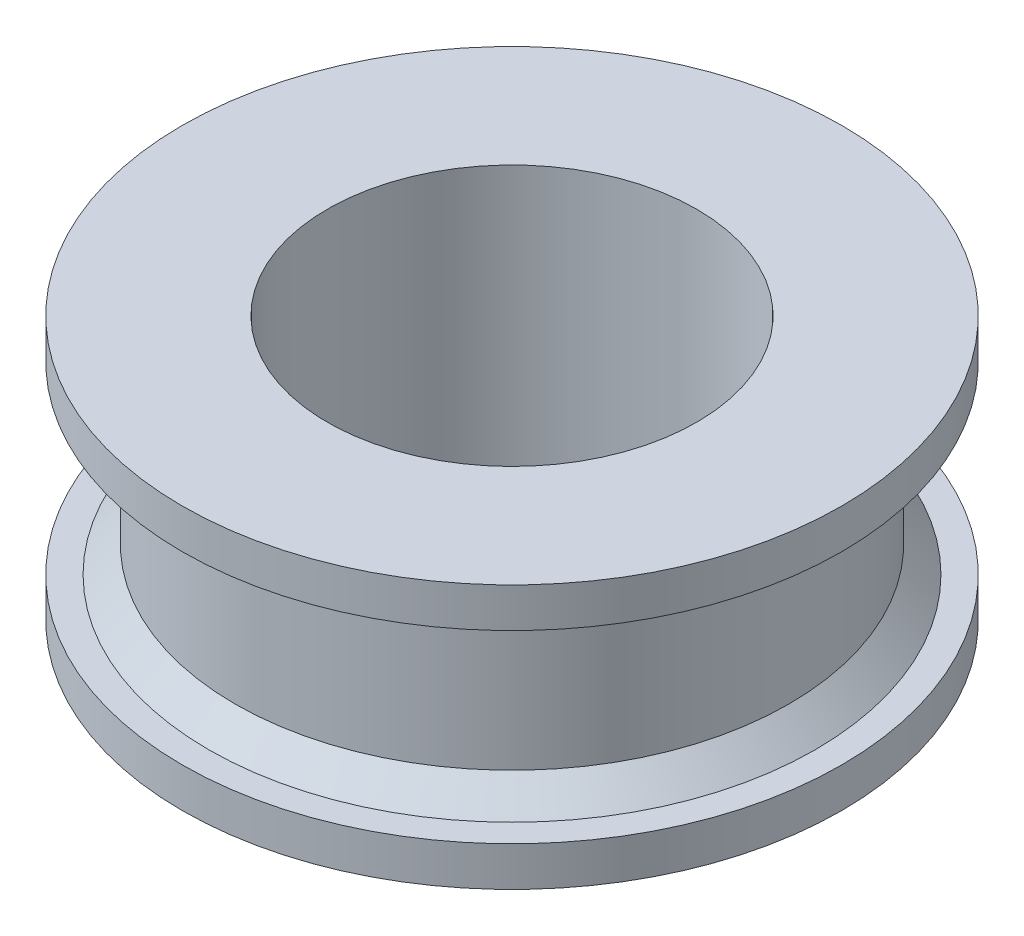
ISO-10303-21;
HEADER;
FILE_DESCRIPTION(('STEP AP214'),'2;1');
FILE_NAME('part.step','',(''),(''),'','','');
FILE_SCHEMA(('AUTOMOTIVE_DESIGN { 1 0 10303 214 1 1 1 1 }'));
ENDSEC;
DATA;
#1=APPLICATION_CONTEXT('core data for automotive mechanical design processes');
#2=APPLICATION_PROTOCOL_DEFINITION('international standard','automotive_design',2000,#1);
#3=PRODUCT_CONTEXT('',#1,'mechanical');
#4=PRODUCT('Part','Part','',(#3));
#5=PRODUCT_RELATED_PRODUCT_CATEGORY('part','',(#4));
#6=PRODUCT_DEFINITION_FORMATION('','',#4);
#7=PRODUCT_DEFINITION_CONTEXT('part definition',#1,'design');
#8=PRODUCT_DEFINITION('design','',#6,#7);
#9=PRODUCT_DEFINITION_SHAPE('','',#8);
#10=(LENGTH_UNIT() NAMED_UNIT(*) SI_UNIT(.MILLI.,.METRE.));
#11=(NAMED_UNIT(*) PLANE_ANGLE_UNIT() SI_UNIT($,.RADIAN.));
#12=(NAMED_UNIT(*) SI_UNIT($,.STERADIAN.) SOLID_ANGLE_UNIT());
#13=UNCERTAINTY_MEASURE_WITH_UNIT(LENGTH_MEASURE(1.E-05),#10,'distance_accuracy_value','');
#14=(GEOMETRIC_REPRESENTATION_CONTEXT(3) GLOBAL_UNCERTAINTY_ASSIGNED_CONTEXT((#13)) GLOBAL_UNIT_ASSIGNED_CONTEXT((#10,
#11,#12)) REPRESENTATION_CONTEXT('',''));
#15=CARTESIAN_POINT('',(0.,0.,0.));
#16=DIRECTION('',(0.,0.,1.));
#17=DIRECTION('',(1.,0.,0.));
#18=AXIS2_PLACEMENT_3D('',#15,#16,#17);
#19=CARTESIAN_POINT('',(12.5,-5.,0.));
#20=DIRECTION('',(0.,-1.,0.));
#21=DIRECTION('',(0.,0.,-1.));
#22=AXIS2_PLACEMENT_3D('',#19,#20,#21);
#23=PLANE('',#22);
#24=CARTESIAN_POINT('',(0.,-5.,0.));
#25=DIRECTION('',(0.,-1.,0.));
#26=DIRECTION('',(0.,0.,-1.));
#27=AXIS2_PLACEMENT_3D('',#24,#25,#26);
#28=CIRCLE('',#27,12.5);
#29=CARTESIAN_POINT('',(0.,-5.,-12.5));
#30=VERTEX_POINT('',#29);
#31=EDGE_CURVE('E79',#30,#30,#28,.T.);
#32=ORIENTED_EDGE('',*,*,#31,.T.);
#33=EDGE_LOOP('',(#32));
#34=FACE_BOUND('',#33,.T.);
#35=CARTESIAN_POINT('',(0.,-5.,0.));
#36=DIRECTION('',(0.,-1.,0.));
#37=DIRECTION('',(0.,0.,-1.));
#38=AXIS2_PLACEMENT_3D('',#35,#36,#37);
#39=CIRCLE('',#38,7.);
#40=CARTESIAN_POINT('',(0.,-5.,-7.));
#41=VERTEX_POINT('',#40);
#42=EDGE_CURVE('E10',#41,#41,#39,.T.);
#43=ORIENTED_EDGE('',*,*,#42,.F.);
#44=EDGE_LOOP('',(#43));
#45=FACE_BOUND('',#44,.T.);
#46=ADVANCED_FACE('F36',(#34,#45),#23,.T.);
#47=CARTESIAN_POINT('',(0.,-14.8448275862069,0.));
#48=DIRECTION('',(0.,-1.,0.));
#49=DIRECTION('',(0.,0.,-1.));
#50=AXIS2_PLACEMENT_3D('',#47,#48,#49);
#51=CYLINDRICAL_SURFACE('',#50,7.);
#52=ORIENTED_EDGE('',*,*,#42,.T.);
#53=EDGE_LOOP('',(#52));
#54=FACE_BOUND('',#53,.T.);
#55=CARTESIAN_POINT('',(0.,5.,0.));
#56=DIRECTION('',(0.,-1.,0.));
#57=DIRECTION('',(0.,0.,-1.));
#58=AXIS2_PLACEMENT_3D('',#55,#56,#57);
#59=CIRCLE('',#58,7.);
#60=CARTESIAN_POINT('',(0.,5.,-7.));
#61=VERTEX_POINT('',#60);
#62=EDGE_CURVE('E43',#61,#61,#59,.T.);
#63=ORIENTED_EDGE('',*,*,#62,.F.);
#64=EDGE_LOOP('',(#63));
#65=FACE_BOUND('',#64,.T.);
#66=ADVANCED_FACE('F98',(#54,#65),#51,.F.);
#67=CARTESIAN_POINT('',(7.,5.,0.));
#68=DIRECTION('',(0.,1.,0.));
#69=DIRECTION('',(0.,0.,1.));
#70=AXIS2_PLACEMENT_3D('',#67,#68,#69);
#71=PLANE('',#70);
#72=ORIENTED_EDGE('',*,*,#62,.T.);
#73=EDGE_LOOP('',(#72));
#74=FACE_BOUND('',#73,.T.);
#75=CARTESIAN_POINT('',(0.,5.,0.));
#76=DIRECTION('',(0.,-1.,0.));
#77=DIRECTION('',(0.,0.,-1.));
#78=AXIS2_PLACEMENT_3D('',#75,#76,#77);
#79=CIRCLE('',#78,12.5);
#80=CARTESIAN_POINT('',(0.,5.,-12.5));
#81=VERTEX_POINT('',#80);
#82=EDGE_CURVE('E48',#81,#81,#79,.T.);
#83=ORIENTED_EDGE('',*,*,#82,.F.);
#84=EDGE_LOOP('',(#83));
#85=FACE_BOUND('',#84,.T.);
#86=ADVANCED_FACE('F102',(#74,#85),#71,.T.);
#87=CARTESIAN_POINT('',(0.,-14.8448275862069,0.));
#88=DIRECTION('',(0.,-1.,0.));
#89=DIRECTION('',(0.,0.,-1.));
#90=AXIS2_PLACEMENT_3D('',#87,#88,#89);
#91=CYLINDRICAL_SURFACE('',#90,12.5);
#92=ORIENTED_EDGE('',*,*,#82,.T.);
#93=EDGE_LOOP('',(#92));
#94=FACE_BOUND('',#93,.T.);
#95=CARTESIAN_POINT('',(0.,3.5,0.));
#96=DIRECTION('',(0.,-1.,0.));
#97=DIRECTION('',(0.,0.,-1.));
#98=AXIS2_PLACEMENT_3D('',#95,#96,#97);
#99=CIRCLE('',#98,12.5);
#100=CARTESIAN_POINT('',(0.,3.5,-12.5));
#101=VERTEX_POINT('',#100);
#102=EDGE_CURVE('E53',#101,#101,#99,.T.);
#103=ORIENTED_EDGE('',*,*,#102,.F.);
#104=EDGE_LOOP('',(#103));
#105=FACE_BOUND('',#104,.T.);
#106=ADVANCED_FACE('F106',(#94,#105),#91,.T.);
#107=CARTESIAN_POINT('',(12.5,3.5,0.));
#108=DIRECTION('',(0.,-1.,0.));
#109=DIRECTION('',(0.,0.,-1.));
#110=AXIS2_PLACEMENT_3D('',#107,#108,#109);
#111=PLANE('',#110);
#112=ORIENTED_EDGE('',*,*,#102,.T.);
#113=EDGE_LOOP('',(#112));
#114=FACE_BOUND('',#113,.T.);
#115=CARTESIAN_POINT('',(0.,3.5,0.));
#116=DIRECTION('',(0.,-1.,0.));
#117=DIRECTION('',(0.,0.,-1.));
#118=AXIS2_PLACEMENT_3D('',#115,#116,#117);
#119=CIRCLE('',#118,11.5);
#120=CARTESIAN_POINT('',(0.,3.5,-11.5));
#121=VERTEX_POINT('',#120);
#122=EDGE_CURVE('E59',#121,#121,#119,.T.);
#123=ORIENTED_EDGE('',*,*,#122,.F.);
#124=EDGE_LOOP('',(#123));
#125=FACE_BOUND('',#124,.T.);
#126=ADVANCED_FACE('F112',(#114,#125),#111,.T.);
#127=CARTESIAN_POINT('',(0.,2.5,0.));
#128=DIRECTION('',(0.,1.,0.));
#129=DIRECTION('',(0.,0.,1.));
#130=AXIS2_PLACEMENT_3D('',#127,#128,#129);
#131=CONICAL_SURFACE('',#130,10.5,0.785398163397449);
#132=ORIENTED_EDGE('',*,*,#122,.T.);
#133=EDGE_LOOP('',(#132));
#134=FACE_BOUND('',#133,.T.);
#135=CARTESIAN_POINT('',(0.,2.5,0.));
#136=DIRECTION('',(0.,-1.,0.));
#137=DIRECTION('',(0.,0.,-1.));
#138=AXIS2_PLACEMENT_3D('',#135,#136,#137);
#139=CIRCLE('',#138,10.5);
#140=CARTESIAN_POINT('',(0.,2.5,-10.5));
#141=VERTEX_POINT('',#140);
#142=EDGE_CURVE('E63',#141,#141,#139,.T.);
#143=ORIENTED_EDGE('',*,*,#142,.F.);
#144=EDGE_LOOP('',(#143));
#145=FACE_BOUND('',#144,.T.);
#146=ADVANCED_FACE('F116',(#134,#145),#131,.T.);
#147=CARTESIAN_POINT('',(0.,-14.8448275862069,0.));
#148=DIRECTION('',(0.,-1.,0.));
#149=DIRECTION('',(0.,0.,-1.));
#150=AXIS2_PLACEMENT_3D('',#147,#148,#149);
#151=CYLINDRICAL_SURFACE('',#150,10.5);
#152=ORIENTED_EDGE('',*,*,#142,.T.);
#153=EDGE_LOOP('',(#152));
#154=FACE_BOUND('',#153,.T.);
#155=CARTESIAN_POINT('',(0.,-2.5,0.));
#156=DIRECTION('',(0.,-1.,0.));
#157=DIRECTION('',(0.,0.,-1.));
#158=AXIS2_PLACEMENT_3D('',#155,#156,#157);
#159=CIRCLE('',#158,10.5);
#160=CARTESIAN_POINT('',(0.,-2.5,-10.5));
#161=VERTEX_POINT('',#160);
#162=EDGE_CURVE('E67',#161,#161,#159,.T.);
#163=ORIENTED_EDGE('',*,*,#162,.F.);
#164=EDGE_LOOP('',(#163));
#165=FACE_BOUND('',#164,.T.);
#166=ADVANCED_FACE('F120',(#154,#165),#151,.T.);
#167=CARTESIAN_POINT('',(0.,-3.5,0.));
#168=DIRECTION('',(0.,-1.,0.));
#169=DIRECTION('',(0.,0.,-1.));
#170=AXIS2_PLACEMENT_3D('',#167,#168,#169);
#171=CONICAL_SURFACE('',#170,11.5,0.785398163397448);
#172=ORIENTED_EDGE('',*,*,#162,.T.);
#173=EDGE_LOOP('',(#172));
#174=FACE_BOUND('',#173,.T.);
#175=CARTESIAN_POINT('',(0.,-3.5,0.));
#176=DIRECTION('',(0.,-1.,0.));
#177=DIRECTION('',(0.,0.,-1.));
#178=AXIS2_PLACEMENT_3D('',#175,#176,#177);
#179=CIRCLE('',#178,11.5);
#180=CARTESIAN_POINT('',(0.,-3.5,-11.5));
#181=VERTEX_POINT('',#180);
#182=EDGE_CURVE('E71',#181,#181,#179,.T.);
#183=ORIENTED_EDGE('',*,*,#182,.F.);
#184=EDGE_LOOP('',(#183));
#185=FACE_BOUND('',#184,.T.);
#186=ADVANCED_FACE('F94',(#174,#185),#171,.T.);
#187=CARTESIAN_POINT('',(11.5,-3.5,0.));
#188=DIRECTION('',(0.,1.,0.));
#189=DIRECTION('',(0.,0.,1.));
#190=AXIS2_PLACEMENT_3D('',#187,#188,#189);
#191=PLANE('',#190);
#192=ORIENTED_EDGE('',*,*,#182,.T.);
#193=EDGE_LOOP('',(#192));
#194=FACE_BOUND('',#193,.T.);
#195=CARTESIAN_POINT('',(0.,-3.5,0.));
#196=DIRECTION('',(0.,-1.,0.));
#197=DIRECTION('',(0.,0.,-1.));
#198=AXIS2_PLACEMENT_3D('',#195,#196,#197);
#199=CIRCLE('',#198,12.5);
#200=CARTESIAN_POINT('',(0.,-3.5,-12.5));
#201=VERTEX_POINT('',#200);
#202=EDGE_CURVE('E75',#201,#201,#199,.T.);
#203=ORIENTED_EDGE('',*,*,#202,.F.);
#204=EDGE_LOOP('',(#203));
#205=FACE_BOUND('',#204,.T.);
#206=ADVANCED_FACE('F88',(#194,#205),#191,.T.);
#207=CARTESIAN_POINT('',(0.,-14.8448275862069,0.));
#208=DIRECTION('',(0.,-1.,0.));
#209=DIRECTION('',(0.,0.,-1.));
#210=AXIS2_PLACEMENT_3D('',#207,#208,#209);
#211=CYLINDRICAL_SURFACE('',#210,12.5);
#212=ORIENTED_EDGE('',*,*,#202,.T.);
#213=EDGE_LOOP('',(#212));
#214=FACE_BOUND('',#213,.T.);
#215=ORIENTED_EDGE('',*,*,#31,.F.);
#216=EDGE_LOOP('',(#215));
#217=FACE_BOUND('',#216,.T.);
#218=ADVANCED_FACE('F86',(#214,#217),#211,.T.);
#219=CLOSED_SHELL('',(#46,#66,#86,#106,#126,#146,#166,#186,#206,#218));
#220=MANIFOLD_SOLID_BREP('B2',#219);
#221=ADVANCED_BREP_SHAPE_REPRESENTATION('',(#18,#220),#14);
#222=SHAPE_DEFINITION_REPRESENTATION(#9,#221);
ENDSEC;
END-ISO-10303-21;
